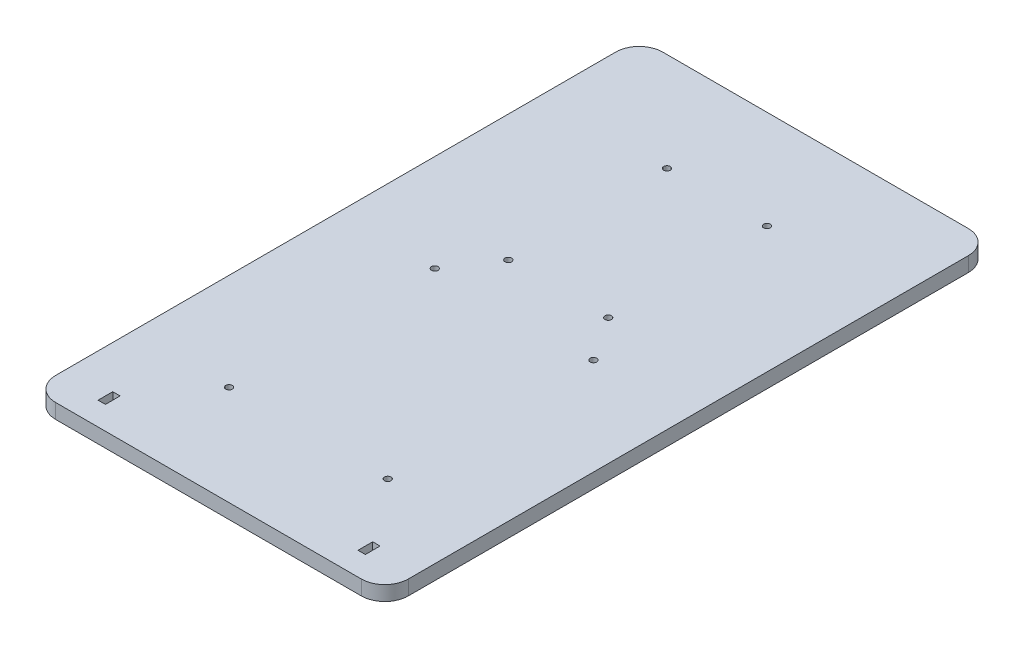
ISO-10303-21;
HEADER;
FILE_DESCRIPTION(('STEP AP214'),'2;1');
FILE_NAME('part.step','',(''),(''),'','','');
FILE_SCHEMA(('AUTOMOTIVE_DESIGN { 1 0 10303 214 1 1 1 1 }'));
ENDSEC;
DATA;
#1=APPLICATION_CONTEXT('core data for automotive mechanical design processes');
#2=APPLICATION_PROTOCOL_DEFINITION('international standard','automotive_design',2000,#1);
#3=PRODUCT_CONTEXT('',#1,'mechanical');
#4=PRODUCT('Part','Part','',(#3));
#5=PRODUCT_RELATED_PRODUCT_CATEGORY('part','',(#4));
#6=PRODUCT_DEFINITION_FORMATION('','',#4);
#7=PRODUCT_DEFINITION_CONTEXT('part definition',#1,'design');
#8=PRODUCT_DEFINITION('design','',#6,#7);
#9=PRODUCT_DEFINITION_SHAPE('','',#8);
#10=(LENGTH_UNIT() NAMED_UNIT(*) SI_UNIT(.MILLI.,.METRE.));
#11=(NAMED_UNIT(*) PLANE_ANGLE_UNIT() SI_UNIT($,.RADIAN.));
#12=(NAMED_UNIT(*) SI_UNIT($,.STERADIAN.) SOLID_ANGLE_UNIT());
#13=UNCERTAINTY_MEASURE_WITH_UNIT(LENGTH_MEASURE(1.E-05),#10,'distance_accuracy_value','');
#14=(GEOMETRIC_REPRESENTATION_CONTEXT(3) GLOBAL_UNCERTAINTY_ASSIGNED_CONTEXT((#13)) GLOBAL_UNIT_ASSIGNED_CONTEXT((#10,
#11,#12)) REPRESENTATION_CONTEXT('',''));
#15=CARTESIAN_POINT('',(0.,0.,0.));
#16=DIRECTION('',(0.,0.,1.));
#17=DIRECTION('',(1.,0.,0.));
#18=AXIS2_PLACEMENT_3D('',#15,#16,#17);
#19=CARTESIAN_POINT('',(0.,6.35,0.));
#20=DIRECTION('',(0.,-1.,0.));
#21=DIRECTION('',(0.,0.,-1.));
#22=AXIS2_PLACEMENT_3D('',#19,#20,#21);
#23=PLANE('',#22);
#24=DIRECTION('',(0.,0.,1.));
#25=VECTOR('',#24,1.);
#26=CARTESIAN_POINT('',(18.4410604,6.35,-16.3877359656356));
#27=LINE('',#26,#25);
#28=CARTESIAN_POINT('',(18.4410604,6.35,-16.3877359656356));
#29=VERTEX_POINT('',#28);
#30=CARTESIAN_POINT('',(18.4410604,6.35,-10.0377359656356));
#31=VERTEX_POINT('',#30);
#32=EDGE_CURVE('E211',#29,#31,#27,.T.);
#33=ORIENTED_EDGE('',*,*,#32,.F.);
#34=DIRECTION('',(-1.,0.,0.));
#35=VECTOR('',#34,1.);
#36=CARTESIAN_POINT('',(18.4410604,6.35,-16.3877359656356));
#37=LINE('',#36,#35);
#38=CARTESIAN_POINT('',(21.6160604,6.35,-16.3877359656356));
#39=VERTEX_POINT('',#38);
#40=EDGE_CURVE('E222',#39,#29,#37,.T.);
#41=ORIENTED_EDGE('',*,*,#40,.F.);
#42=DIRECTION('',(0.,0.,-1.));
#43=VECTOR('',#42,1.);
#44=CARTESIAN_POINT('',(21.6160604,6.35,-16.3877359656356));
#45=LINE('',#44,#43);
#46=CARTESIAN_POINT('',(21.6160604,6.35,-10.0377359656356));
#47=VERTEX_POINT('',#46);
#48=EDGE_CURVE('E218',#47,#39,#45,.T.);
#49=ORIENTED_EDGE('',*,*,#48,.F.);
#50=DIRECTION('',(1.,0.,0.));
#51=VECTOR('',#50,1.);
#52=CARTESIAN_POINT('',(18.4410604,6.35,-10.0377359656356));
#53=LINE('',#52,#51);
#54=EDGE_CURVE('E214',#31,#47,#53,.T.);
#55=ORIENTED_EDGE('',*,*,#54,.F.);
#56=EDGE_LOOP('',(#33,#41,#49,#55));
#57=FACE_BOUND('',#56,.T.);
#58=DIRECTION('',(1.,0.,0.));
#59=VECTOR('',#58,1.);
#60=CARTESIAN_POINT('',(152.4,6.35,0.));
#61=LINE('',#60,#59);
#62=CARTESIAN_POINT('',(10.1600000000001,6.35,0.));
#63=VERTEX_POINT('',#62);
#64=CARTESIAN_POINT('',(142.24,6.35,0.));
#65=VERTEX_POINT('',#64);
#66=EDGE_CURVE('E258',#63,#65,#61,.T.);
#67=ORIENTED_EDGE('',*,*,#66,.T.);
#68=CARTESIAN_POINT('',(142.24,6.35,-10.16));
#69=DIRECTION('',(0.,-1.,0.));
#70=DIRECTION('',(0.,0.,-1.));
#71=AXIS2_PLACEMENT_3D('',#68,#69,#70);
#72=CIRCLE('',#71,10.16);
#73=CARTESIAN_POINT('',(152.4,6.35,-10.16));
#74=VERTEX_POINT('',#73);
#75=EDGE_CURVE('E316',#65,#74,#72,.F.);
#76=ORIENTED_EDGE('',*,*,#75,.T.);
#77=DIRECTION('',(0.,0.,-1.));
#78=VECTOR('',#77,1.);
#79=CARTESIAN_POINT('',(152.4,6.35,-262.339276313461));
#80=LINE('',#79,#78);
#81=CARTESIAN_POINT('',(152.4,6.35,-252.179276313461));
#82=VERTEX_POINT('',#81);
#83=EDGE_CURVE('E263',#74,#82,#80,.T.);
#84=ORIENTED_EDGE('',*,*,#83,.T.);
#85=CARTESIAN_POINT('',(142.24,6.35,-252.179276313461));
#86=DIRECTION('',(0.,-1.,0.));
#87=DIRECTION('',(0.,0.,-1.));
#88=AXIS2_PLACEMENT_3D('',#85,#86,#87);
#89=CIRCLE('',#88,10.16);
#90=CARTESIAN_POINT('',(142.24,6.35,-262.339276313461));
#91=VERTEX_POINT('',#90);
#92=EDGE_CURVE('E62',#82,#91,#89,.F.);
#93=ORIENTED_EDGE('',*,*,#92,.T.);
#94=DIRECTION('',(-1.,0.,0.));
#95=VECTOR('',#94,1.);
#96=CARTESIAN_POINT('',(0.,6.35,-262.339276313461));
#97=LINE('',#96,#95);
#98=CARTESIAN_POINT('',(10.16,6.35,-262.339276313461));
#99=VERTEX_POINT('',#98);
#100=EDGE_CURVE('E266',#91,#99,#97,.T.);
#101=ORIENTED_EDGE('',*,*,#100,.T.);
#102=CARTESIAN_POINT('',(10.16,6.35,-252.179276313461));
#103=DIRECTION('',(0.,-1.,0.));
#104=DIRECTION('',(0.,0.,-1.));
#105=AXIS2_PLACEMENT_3D('',#102,#103,#104);
#106=CIRCLE('',#105,10.16);
#107=CARTESIAN_POINT('',(0.,6.35,-252.179276313461));
#108=VERTEX_POINT('',#107);
#109=EDGE_CURVE('E308',#99,#108,#106,.F.);
#110=ORIENTED_EDGE('',*,*,#109,.T.);
#111=DIRECTION('',(0.,0.,1.));
#112=VECTOR('',#111,1.);
#113=CARTESIAN_POINT('',(0.,6.35,0.));
#114=LINE('',#113,#112);
#115=CARTESIAN_POINT('',(0.,6.35,-10.16));
#116=VERTEX_POINT('',#115);
#117=EDGE_CURVE('E254',#108,#116,#114,.T.);
#118=ORIENTED_EDGE('',*,*,#117,.T.);
#119=CARTESIAN_POINT('',(10.16,6.35,-10.16));
#120=DIRECTION('',(0.,-1.,0.));
#121=DIRECTION('',(0.,0.,-1.));
#122=AXIS2_PLACEMENT_3D('',#119,#120,#121);
#123=CIRCLE('',#122,10.16);
#124=EDGE_CURVE('E311',#116,#63,#123,.F.);
#125=ORIENTED_EDGE('',*,*,#124,.T.);
#126=EDGE_LOOP('',(#67,#76,#84,#93,#101,#110,#118,#125));
#127=FACE_BOUND('',#126,.T.);
#128=DIRECTION('',(0.,0.,-1.));
#129=VECTOR('',#128,1.);
#130=CARTESIAN_POINT('',(133.9589396,6.35,-16.3877359656356));
#131=LINE('',#130,#129);
#132=CARTESIAN_POINT('',(133.9589396,6.35,-10.0377359656356));
#133=VERTEX_POINT('',#132);
#134=CARTESIAN_POINT('',(133.9589396,6.35,-16.3877359656356));
#135=VERTEX_POINT('',#134);
#136=EDGE_CURVE('E155',#133,#135,#131,.T.);
#137=ORIENTED_EDGE('',*,*,#136,.F.);
#138=DIRECTION('',(1.,0.,0.));
#139=VECTOR('',#138,1.);
#140=CARTESIAN_POINT('',(133.9589396,6.35,-10.0377359656356));
#141=LINE('',#140,#139);
#142=CARTESIAN_POINT('',(130.7839396,6.35,-10.0377359656356));
#143=VERTEX_POINT('',#142);
#144=EDGE_CURVE('E185',#143,#133,#141,.T.);
#145=ORIENTED_EDGE('',*,*,#144,.F.);
#146=DIRECTION('',(0.,0.,1.));
#147=VECTOR('',#146,1.);
#148=CARTESIAN_POINT('',(130.7839396,6.35,-16.3877359656356));
#149=LINE('',#148,#147);
#150=CARTESIAN_POINT('',(130.7839396,6.35,-16.3877359656356));
#151=VERTEX_POINT('',#150);
#152=EDGE_CURVE('E181',#151,#143,#149,.T.);
#153=ORIENTED_EDGE('',*,*,#152,.F.);
#154=DIRECTION('',(-1.,0.,0.));
#155=VECTOR('',#154,1.);
#156=CARTESIAN_POINT('',(133.9589396,6.35,-16.3877359656356));
#157=LINE('',#156,#155);
#158=EDGE_CURVE('E166',#135,#151,#157,.T.);
#159=ORIENTED_EDGE('',*,*,#158,.F.);
#160=EDGE_LOOP('',(#137,#145,#153,#159));
#161=FACE_BOUND('',#160,.T.);
#162=CARTESIAN_POINT('',(41.9100000000001,6.35,-43.18));
#163=DIRECTION('',(0.,1.,0.));
#164=DIRECTION('',(0.,0.,1.));
#165=AXIS2_PLACEMENT_3D('',#162,#163,#164);
#166=CIRCLE('',#165,1.4224);
#167=CARTESIAN_POINT('',(41.9100000000001,6.35,-41.7576));
#168=VERTEX_POINT('',#167);
#169=EDGE_CURVE('E194',#168,#168,#166,.T.);
#170=ORIENTED_EDGE('',*,*,#169,.F.);
#171=EDGE_LOOP('',(#170));
#172=FACE_BOUND('',#171,.T.);
#173=CARTESIAN_POINT('',(41.9100000000001,6.35,-132.08));
#174=DIRECTION('',(0.,1.,0.));
#175=DIRECTION('',(0.,0.,1.));
#176=AXIS2_PLACEMENT_3D('',#173,#174,#175);
#177=CIRCLE('',#176,1.4224);
#178=CARTESIAN_POINT('',(41.9100000000001,6.35,-130.6576));
#179=VERTEX_POINT('',#178);
#180=EDGE_CURVE('E667',#179,#179,#177,.T.);
#181=ORIENTED_EDGE('',*,*,#180,.F.);
#182=EDGE_LOOP('',(#181));
#183=FACE_BOUND('',#182,.T.);
#184=CARTESIAN_POINT('',(110.49,6.35,-132.08));
#185=DIRECTION('',(0.,1.,0.));
#186=DIRECTION('',(0.,0.,-1.));
#187=AXIS2_PLACEMENT_3D('',#184,#185,#186);
#188=CIRCLE('',#187,1.4224);
#189=CARTESIAN_POINT('',(110.49,6.35,-133.5024));
#190=VERTEX_POINT('',#189);
#191=EDGE_CURVE('E660',#190,#190,#188,.T.);
#192=ORIENTED_EDGE('',*,*,#191,.F.);
#193=EDGE_LOOP('',(#192));
#194=FACE_BOUND('',#193,.T.);
#195=CARTESIAN_POINT('',(110.49,6.35,-43.18));
#196=DIRECTION('',(0.,1.,0.));
#197=DIRECTION('',(0.,0.,-1.));
#198=AXIS2_PLACEMENT_3D('',#195,#196,#197);
#199=CIRCLE('',#198,1.42239999999999);
#200=CARTESIAN_POINT('',(110.49,6.35,-44.6024));
#201=VERTEX_POINT('',#200);
#202=EDGE_CURVE('E653',#201,#201,#199,.T.);
#203=ORIENTED_EDGE('',*,*,#202,.F.);
#204=EDGE_LOOP('',(#203));
#205=FACE_BOUND('',#204,.T.);
#206=CARTESIAN_POINT('',(54.6100000000001,6.35,-219.73766874797));
#207=DIRECTION('',(0.,1.,0.));
#208=DIRECTION('',(0.,0.,1.));
#209=AXIS2_PLACEMENT_3D('',#206,#207,#208);
#210=CIRCLE('',#209,1.4224);
#211=CARTESIAN_POINT('',(54.6100000000001,6.35,-218.31526874797));
#212=VERTEX_POINT('',#211);
#213=EDGE_CURVE('E646',#212,#212,#210,.T.);
#214=ORIENTED_EDGE('',*,*,#213,.F.);
#215=EDGE_LOOP('',(#214));
#216=FACE_BOUND('',#215,.T.);
#217=CARTESIAN_POINT('',(54.6100000000001,6.35,-151.15766874797));
#218=DIRECTION('',(0.,1.,0.));
#219=DIRECTION('',(0.,0.,1.));
#220=AXIS2_PLACEMENT_3D('',#217,#218,#219);
#221=CIRCLE('',#220,1.4224);
#222=CARTESIAN_POINT('',(54.6100000000001,6.35,-149.73526874797));
#223=VERTEX_POINT('',#222);
#224=EDGE_CURVE('E639',#223,#223,#221,.T.);
#225=ORIENTED_EDGE('',*,*,#224,.F.);
#226=EDGE_LOOP('',(#225));
#227=FACE_BOUND('',#226,.T.);
#228=CARTESIAN_POINT('',(97.7900000000001,6.35,-151.15766874797));
#229=DIRECTION('',(0.,1.,0.));
#230=DIRECTION('',(0.,0.,-1.));
#231=AXIS2_PLACEMENT_3D('',#228,#229,#230);
#232=CIRCLE('',#231,1.4224);
#233=CARTESIAN_POINT('',(97.7900000000001,6.35,-152.58006874797));
#234=VERTEX_POINT('',#233);
#235=EDGE_CURVE('E632',#234,#234,#232,.T.);
#236=ORIENTED_EDGE('',*,*,#235,.F.);
#237=EDGE_LOOP('',(#236));
#238=FACE_BOUND('',#237,.T.);
#239=CARTESIAN_POINT('',(97.7900000000001,6.35,-219.73766874797));
#240=DIRECTION('',(0.,1.,0.));
#241=DIRECTION('',(0.,0.,-1.));
#242=AXIS2_PLACEMENT_3D('',#239,#240,#241);
#243=CIRCLE('',#242,1.4224);
#244=CARTESIAN_POINT('',(97.7900000000001,6.35,-221.16006874797));
#245=VERTEX_POINT('',#244);
#246=EDGE_CURVE('E625',#245,#245,#243,.T.);
#247=ORIENTED_EDGE('',*,*,#246,.F.);
#248=EDGE_LOOP('',(#247));
#249=FACE_BOUND('',#248,.T.);
#250=ADVANCED_FACE('F39',(#57,#127,#161,#172,#183,#194,#205,#216,#227,#238,#249),#23,.F.);
#251=CARTESIAN_POINT('',(0.,0.,0.));
#252=DIRECTION('',(0.,-1.,0.));
#253=DIRECTION('',(0.,0.,-1.));
#254=AXIS2_PLACEMENT_3D('',#251,#252,#253);
#255=PLANE('',#254);
#256=CARTESIAN_POINT('',(97.7900000000001,0.,-151.15766874797));
#257=DIRECTION('',(0.,1.,0.));
#258=DIRECTION('',(0.,0.,-1.));
#259=AXIS2_PLACEMENT_3D('',#256,#257,#258);
#260=CIRCLE('',#259,1.4224);
#261=CARTESIAN_POINT('',(97.7900000000001,0.,-152.58006874797));
#262=VERTEX_POINT('',#261);
#263=EDGE_CURVE('E629',#262,#262,#260,.T.);
#264=ORIENTED_EDGE('',*,*,#263,.T.);
#265=EDGE_LOOP('',(#264));
#266=FACE_BOUND('',#265,.T.);
#267=CARTESIAN_POINT('',(54.6100000000001,0.,-219.73766874797));
#268=DIRECTION('',(0.,1.,0.));
#269=DIRECTION('',(0.,0.,1.));
#270=AXIS2_PLACEMENT_3D('',#267,#268,#269);
#271=CIRCLE('',#270,1.4224);
#272=CARTESIAN_POINT('',(54.6100000000001,0.,-218.31526874797));
#273=VERTEX_POINT('',#272);
#274=EDGE_CURVE('E643',#273,#273,#271,.T.);
#275=ORIENTED_EDGE('',*,*,#274,.T.);
#276=EDGE_LOOP('',(#275));
#277=FACE_BOUND('',#276,.T.);
#278=CARTESIAN_POINT('',(110.49,0.,-132.08));
#279=DIRECTION('',(0.,1.,0.));
#280=DIRECTION('',(0.,0.,-1.));
#281=AXIS2_PLACEMENT_3D('',#278,#279,#280);
#282=CIRCLE('',#281,1.4224);
#283=CARTESIAN_POINT('',(110.49,0.,-133.5024));
#284=VERTEX_POINT('',#283);
#285=EDGE_CURVE('E657',#284,#284,#282,.T.);
#286=ORIENTED_EDGE('',*,*,#285,.T.);
#287=EDGE_LOOP('',(#286));
#288=FACE_BOUND('',#287,.T.);
#289=CARTESIAN_POINT('',(41.9100000000001,0.,-43.18));
#290=DIRECTION('',(0.,1.,0.));
#291=DIRECTION('',(0.,0.,1.));
#292=AXIS2_PLACEMENT_3D('',#289,#290,#291);
#293=CIRCLE('',#292,1.4224);
#294=CARTESIAN_POINT('',(41.9100000000001,0.,-41.7576));
#295=VERTEX_POINT('',#294);
#296=EDGE_CURVE('E671',#295,#295,#293,.T.);
#297=ORIENTED_EDGE('',*,*,#296,.T.);
#298=EDGE_LOOP('',(#297));
#299=FACE_BOUND('',#298,.T.);
#300=DIRECTION('',(0.,0.,-1.));
#301=VECTOR('',#300,1.);
#302=CARTESIAN_POINT('',(152.4,0.,-262.339276313461));
#303=LINE('',#302,#301);
#304=CARTESIAN_POINT('',(152.4,0.,-10.16));
#305=VERTEX_POINT('',#304);
#306=CARTESIAN_POINT('',(152.4,0.,-252.179276313461));
#307=VERTEX_POINT('',#306);
#308=EDGE_CURVE('E277',#305,#307,#303,.T.);
#309=ORIENTED_EDGE('',*,*,#308,.F.);
#310=CARTESIAN_POINT('',(142.24,0.,-10.16));
#311=DIRECTION('',(0.,-1.,0.));
#312=DIRECTION('',(0.,0.,-1.));
#313=AXIS2_PLACEMENT_3D('',#310,#311,#312);
#314=CIRCLE('',#313,10.16);
#315=CARTESIAN_POINT('',(142.24,0.,0.));
#316=VERTEX_POINT('',#315);
#317=EDGE_CURVE('E298',#305,#316,#314,.T.);
#318=ORIENTED_EDGE('',*,*,#317,.T.);
#319=DIRECTION('',(1.,0.,0.));
#320=VECTOR('',#319,1.);
#321=CARTESIAN_POINT('',(152.4,0.,0.));
#322=LINE('',#321,#320);
#323=CARTESIAN_POINT('',(10.1600000000001,0.,0.));
#324=VERTEX_POINT('',#323);
#325=EDGE_CURVE('E273',#324,#316,#322,.T.);
#326=ORIENTED_EDGE('',*,*,#325,.F.);
#327=CARTESIAN_POINT('',(10.16,0.,-10.16));
#328=DIRECTION('',(0.,-1.,0.));
#329=DIRECTION('',(0.,0.,-1.));
#330=AXIS2_PLACEMENT_3D('',#327,#328,#329);
#331=CIRCLE('',#330,10.16);
#332=CARTESIAN_POINT('',(0.,0.,-10.16));
#333=VERTEX_POINT('',#332);
#334=EDGE_CURVE('E292',#324,#333,#331,.T.);
#335=ORIENTED_EDGE('',*,*,#334,.T.);
#336=DIRECTION('',(0.,0.,1.));
#337=VECTOR('',#336,1.);
#338=CARTESIAN_POINT('',(0.,0.,0.));
#339=LINE('',#338,#337);
#340=CARTESIAN_POINT('',(0.,0.,-252.179276313461));
#341=VERTEX_POINT('',#340);
#342=EDGE_CURVE('E253',#341,#333,#339,.T.);
#343=ORIENTED_EDGE('',*,*,#342,.F.);
#344=CARTESIAN_POINT('',(10.16,0.,-252.179276313461));
#345=DIRECTION('',(0.,-1.,0.));
#346=DIRECTION('',(0.,0.,-1.));
#347=AXIS2_PLACEMENT_3D('',#344,#345,#346);
#348=CIRCLE('',#347,10.16);
#349=CARTESIAN_POINT('',(10.16,0.,-262.339276313461));
#350=VERTEX_POINT('',#349);
#351=EDGE_CURVE('E289',#341,#350,#348,.T.);
#352=ORIENTED_EDGE('',*,*,#351,.T.);
#353=DIRECTION('',(-1.,0.,0.));
#354=VECTOR('',#353,1.);
#355=CARTESIAN_POINT('',(0.,0.,-262.339276313461));
#356=LINE('',#355,#354);
#357=CARTESIAN_POINT('',(142.24,0.,-262.339276313461));
#358=VERTEX_POINT('',#357);
#359=EDGE_CURVE('E259',#358,#350,#356,.T.);
#360=ORIENTED_EDGE('',*,*,#359,.F.);
#361=CARTESIAN_POINT('',(142.24,0.,-252.179276313461));
#362=DIRECTION('',(0.,-1.,0.));
#363=DIRECTION('',(0.,0.,-1.));
#364=AXIS2_PLACEMENT_3D('',#361,#362,#363);
#365=CIRCLE('',#364,10.16);
#366=EDGE_CURVE('E295',#358,#307,#365,.T.);
#367=ORIENTED_EDGE('',*,*,#366,.T.);
#368=EDGE_LOOP('',(#309,#318,#326,#335,#343,#352,#360,#367));
#369=FACE_BOUND('',#368,.T.);
#370=DIRECTION('',(-1.,0.,0.));
#371=VECTOR('',#370,1.);
#372=CARTESIAN_POINT('',(18.4410604,0.,-16.3877359656356));
#373=LINE('',#372,#371);
#374=CARTESIAN_POINT('',(21.6160604,0.,-16.3877359656356));
#375=VERTEX_POINT('',#374);
#376=CARTESIAN_POINT('',(18.4410604,0.,-16.3877359656356));
#377=VERTEX_POINT('',#376);
#378=EDGE_CURVE('E215',#375,#377,#373,.T.);
#379=ORIENTED_EDGE('',*,*,#378,.T.);
#380=DIRECTION('',(0.,0.,1.));
#381=VECTOR('',#380,1.);
#382=CARTESIAN_POINT('',(18.4410604,0.,-16.3877359656356));
#383=LINE('',#382,#381);
#384=CARTESIAN_POINT('',(18.4410604,0.,-10.0377359656356));
#385=VERTEX_POINT('',#384);
#386=EDGE_CURVE('E175',#377,#385,#383,.T.);
#387=ORIENTED_EDGE('',*,*,#386,.T.);
#388=DIRECTION('',(1.,0.,0.));
#389=VECTOR('',#388,1.);
#390=CARTESIAN_POINT('',(18.4410604,0.,-10.0377359656356));
#391=LINE('',#390,#389);
#392=CARTESIAN_POINT('',(21.6160604,0.,-10.0377359656356));
#393=VERTEX_POINT('',#392);
#394=EDGE_CURVE('E229',#385,#393,#391,.T.);
#395=ORIENTED_EDGE('',*,*,#394,.T.);
#396=DIRECTION('',(0.,0.,-1.));
#397=VECTOR('',#396,1.);
#398=CARTESIAN_POINT('',(21.6160604,0.,-16.3877359656356));
#399=LINE('',#398,#397);
#400=EDGE_CURVE('E233',#393,#375,#399,.T.);
#401=ORIENTED_EDGE('',*,*,#400,.T.);
#402=EDGE_LOOP('',(#379,#387,#395,#401));
#403=FACE_BOUND('',#402,.T.);
#404=DIRECTION('',(1.,0.,0.));
#405=VECTOR('',#404,1.);
#406=CARTESIAN_POINT('',(133.9589396,0.,-10.0377359656356));
#407=LINE('',#406,#405);
#408=CARTESIAN_POINT('',(130.7839396,0.,-10.0377359656356));
#409=VERTEX_POINT('',#408);
#410=CARTESIAN_POINT('',(133.9589396,0.,-10.0377359656356));
#411=VERTEX_POINT('',#410);
#412=EDGE_CURVE('E167',#409,#411,#407,.T.);
#413=ORIENTED_EDGE('',*,*,#412,.T.);
#414=DIRECTION('',(0.,0.,-1.));
#415=VECTOR('',#414,1.);
#416=CARTESIAN_POINT('',(133.9589396,0.,-16.3877359656356));
#417=LINE('',#416,#415);
#418=CARTESIAN_POINT('',(133.9589396,0.,-16.3877359656356));
#419=VERTEX_POINT('',#418);
#420=EDGE_CURVE('E191',#411,#419,#417,.T.);
#421=ORIENTED_EDGE('',*,*,#420,.T.);
#422=DIRECTION('',(-1.,0.,0.));
#423=VECTOR('',#422,1.);
#424=CARTESIAN_POINT('',(133.9589396,0.,-16.3877359656356));
#425=LINE('',#424,#423);
#426=CARTESIAN_POINT('',(130.7839396,0.,-16.3877359656356));
#427=VERTEX_POINT('',#426);
#428=EDGE_CURVE('E173',#419,#427,#425,.T.);
#429=ORIENTED_EDGE('',*,*,#428,.T.);
#430=DIRECTION('',(0.,0.,1.));
#431=VECTOR('',#430,1.);
#432=CARTESIAN_POINT('',(130.7839396,0.,-16.3877359656356));
#433=LINE('',#432,#431);
#434=EDGE_CURVE('E197',#427,#409,#433,.T.);
#435=ORIENTED_EDGE('',*,*,#434,.T.);
#436=EDGE_LOOP('',(#413,#421,#429,#435));
#437=FACE_BOUND('',#436,.T.);
#438=CARTESIAN_POINT('',(41.9100000000001,0.,-132.08));
#439=DIRECTION('',(0.,1.,0.));
#440=DIRECTION('',(0.,0.,1.));
#441=AXIS2_PLACEMENT_3D('',#438,#439,#440);
#442=CIRCLE('',#441,1.4224);
#443=CARTESIAN_POINT('',(41.9100000000001,0.,-130.6576));
#444=VERTEX_POINT('',#443);
#445=EDGE_CURVE('E611',#444,#444,#442,.T.);
#446=ORIENTED_EDGE('',*,*,#445,.T.);
#447=EDGE_LOOP('',(#446));
#448=FACE_BOUND('',#447,.T.);
#449=CARTESIAN_POINT('',(110.49,0.,-43.18));
#450=DIRECTION('',(0.,1.,0.));
#451=DIRECTION('',(0.,0.,-1.));
#452=AXIS2_PLACEMENT_3D('',#449,#450,#451);
#453=CIRCLE('',#452,1.42239999999999);
#454=CARTESIAN_POINT('',(110.49,0.,-44.6024));
#455=VERTEX_POINT('',#454);
#456=EDGE_CURVE('E615',#455,#455,#453,.T.);
#457=ORIENTED_EDGE('',*,*,#456,.T.);
#458=EDGE_LOOP('',(#457));
#459=FACE_BOUND('',#458,.T.);
#460=CARTESIAN_POINT('',(54.6100000000001,0.,-151.15766874797));
#461=DIRECTION('',(0.,1.,0.));
#462=DIRECTION('',(0.,0.,1.));
#463=AXIS2_PLACEMENT_3D('',#460,#461,#462);
#464=CIRCLE('',#463,1.4224);
#465=CARTESIAN_POINT('',(54.6100000000001,0.,-149.73526874797));
#466=VERTEX_POINT('',#465);
#467=EDGE_CURVE('E619',#466,#466,#464,.T.);
#468=ORIENTED_EDGE('',*,*,#467,.T.);
#469=EDGE_LOOP('',(#468));
#470=FACE_BOUND('',#469,.T.);
#471=CARTESIAN_POINT('',(97.7900000000001,0.,-219.73766874797));
#472=DIRECTION('',(0.,1.,0.));
#473=DIRECTION('',(0.,0.,-1.));
#474=AXIS2_PLACEMENT_3D('',#471,#472,#473);
#475=CIRCLE('',#474,1.4224);
#476=CARTESIAN_POINT('',(97.7900000000001,0.,-221.16006874797));
#477=VERTEX_POINT('',#476);
#478=EDGE_CURVE('E622',#477,#477,#475,.T.);
#479=ORIENTED_EDGE('',*,*,#478,.T.);
#480=EDGE_LOOP('',(#479));
#481=FACE_BOUND('',#480,.T.);
#482=ADVANCED_FACE('F336',(#266,#277,#288,#299,#369,#403,#437,#448,#459,#470,#481),#255,.T.);
#483=CARTESIAN_POINT('',(0.,6.35,0.));
#484=DIRECTION('',(1.,0.,0.));
#485=DIRECTION('',(0.,0.,-1.));
#486=AXIS2_PLACEMENT_3D('',#483,#484,#485);
#487=PLANE('',#486);
#488=ORIENTED_EDGE('',*,*,#342,.T.);
#489=DIRECTION('',(0.,-1.,0.));
#490=VECTOR('',#489,1.);
#491=CARTESIAN_POINT('',(0.,6.35,-10.16));
#492=LINE('',#491,#490);
#493=EDGE_CURVE('E11',#333,#116,#492,.F.);
#494=ORIENTED_EDGE('',*,*,#493,.T.);
#495=ORIENTED_EDGE('',*,*,#117,.F.);
#496=DIRECTION('',(0.,-1.,0.));
#497=VECTOR('',#496,1.);
#498=CARTESIAN_POINT('',(0.,6.35,-252.179276313461));
#499=LINE('',#498,#497);
#500=EDGE_CURVE('E48',#108,#341,#499,.T.);
#501=ORIENTED_EDGE('',*,*,#500,.T.);
#502=EDGE_LOOP('',(#488,#494,#495,#501));
#503=FACE_BOUND('',#502,.T.);
#504=ADVANCED_FACE('F330',(#503),#487,.F.);
#505=CARTESIAN_POINT('',(152.4,6.35,0.));
#506=DIRECTION('',(0.,0.,-1.));
#507=DIRECTION('',(-1.,0.,0.));
#508=AXIS2_PLACEMENT_3D('',#505,#506,#507);
#509=PLANE('',#508);
#510=ORIENTED_EDGE('',*,*,#325,.T.);
#511=DIRECTION('',(0.,-1.,0.));
#512=VECTOR('',#511,1.);
#513=CARTESIAN_POINT('',(142.24,6.35,0.));
#514=LINE('',#513,#512);
#515=EDGE_CURVE('E305',#316,#65,#514,.F.);
#516=ORIENTED_EDGE('',*,*,#515,.T.);
#517=ORIENTED_EDGE('',*,*,#66,.F.);
#518=DIRECTION('',(0.,-1.,0.));
#519=VECTOR('',#518,1.);
#520=CARTESIAN_POINT('',(10.16,6.35,0.));
#521=LINE('',#520,#519);
#522=EDGE_CURVE('E301',#63,#324,#521,.T.);
#523=ORIENTED_EDGE('',*,*,#522,.T.);
#524=EDGE_LOOP('',(#510,#516,#517,#523));
#525=FACE_BOUND('',#524,.T.);
#526=ADVANCED_FACE('F346',(#525),#509,.F.);
#527=CARTESIAN_POINT('',(152.4,6.35,-262.339276313461));
#528=DIRECTION('',(-1.,0.,0.));
#529=DIRECTION('',(0.,0.,1.));
#530=AXIS2_PLACEMENT_3D('',#527,#528,#529);
#531=PLANE('',#530);
#532=ORIENTED_EDGE('',*,*,#83,.F.);
#533=DIRECTION('',(0.,-1.,0.));
#534=VECTOR('',#533,1.);
#535=CARTESIAN_POINT('',(152.4,6.35,-10.16));
#536=LINE('',#535,#534);
#537=EDGE_CURVE('E285',#74,#305,#536,.T.);
#538=ORIENTED_EDGE('',*,*,#537,.T.);
#539=ORIENTED_EDGE('',*,*,#308,.T.);
#540=DIRECTION('',(0.,-1.,0.));
#541=VECTOR('',#540,1.);
#542=CARTESIAN_POINT('',(152.4,6.35,-252.179276313461));
#543=LINE('',#542,#541);
#544=EDGE_CURVE('E269',#307,#82,#543,.F.);
#545=ORIENTED_EDGE('',*,*,#544,.T.);
#546=EDGE_LOOP('',(#532,#538,#539,#545));
#547=FACE_BOUND('',#546,.T.);
#548=ADVANCED_FACE('F354',(#547),#531,.F.);
#549=CARTESIAN_POINT('',(0.,6.35,-262.339276313461));
#550=DIRECTION('',(0.,0.,1.));
#551=DIRECTION('',(1.,0.,0.));
#552=AXIS2_PLACEMENT_3D('',#549,#550,#551);
#553=PLANE('',#552);
#554=ORIENTED_EDGE('',*,*,#100,.F.);
#555=DIRECTION('',(0.,-1.,0.));
#556=VECTOR('',#555,1.);
#557=CARTESIAN_POINT('',(142.24,6.35,-262.339276313461));
#558=LINE('',#557,#556);
#559=EDGE_CURVE('E321',#91,#358,#558,.T.);
#560=ORIENTED_EDGE('',*,*,#559,.T.);
#561=ORIENTED_EDGE('',*,*,#359,.T.);
#562=DIRECTION('',(0.,-1.,0.));
#563=VECTOR('',#562,1.);
#564=CARTESIAN_POINT('',(10.16,6.35,-262.339276313461));
#565=LINE('',#564,#563);
#566=EDGE_CURVE('E55',#350,#99,#565,.F.);
#567=ORIENTED_EDGE('',*,*,#566,.T.);
#568=EDGE_LOOP('',(#554,#560,#561,#567));
#569=FACE_BOUND('',#568,.T.);
#570=ADVANCED_FACE('F359',(#569),#553,.F.);
#571=CARTESIAN_POINT('',(18.4410604,6.35,-16.3877359656356));
#572=DIRECTION('',(1.,0.,0.));
#573=DIRECTION('',(0.,0.,-1.));
#574=AXIS2_PLACEMENT_3D('',#571,#572,#573);
#575=PLANE('',#574);
#576=ORIENTED_EDGE('',*,*,#386,.F.);
#577=DIRECTION('',(0.,-1.,0.));
#578=VECTOR('',#577,1.);
#579=CARTESIAN_POINT('',(18.4410604,6.35,-16.3877359656356));
#580=LINE('',#579,#578);
#581=EDGE_CURVE('E225',#29,#377,#580,.T.);
#582=ORIENTED_EDGE('',*,*,#581,.F.);
#583=ORIENTED_EDGE('',*,*,#32,.T.);
#584=DIRECTION('',(0.,-1.,0.));
#585=VECTOR('',#584,1.);
#586=CARTESIAN_POINT('',(18.4410604,6.35,-10.0377359656356));
#587=LINE('',#586,#585);
#588=EDGE_CURVE('E249',#31,#385,#587,.T.);
#589=ORIENTED_EDGE('',*,*,#588,.T.);
#590=EDGE_LOOP('',(#576,#582,#583,#589));
#591=FACE_BOUND('',#590,.T.);
#592=ADVANCED_FACE('F374',(#591),#575,.T.);
#593=CARTESIAN_POINT('',(18.4410604,6.35,-10.0377359656356));
#594=DIRECTION('',(0.,0.,-1.));
#595=DIRECTION('',(-1.,0.,0.));
#596=AXIS2_PLACEMENT_3D('',#593,#594,#595);
#597=PLANE('',#596);
#598=ORIENTED_EDGE('',*,*,#394,.F.);
#599=ORIENTED_EDGE('',*,*,#588,.F.);
#600=ORIENTED_EDGE('',*,*,#54,.T.);
#601=DIRECTION('',(0.,-1.,0.));
#602=VECTOR('',#601,1.);
#603=CARTESIAN_POINT('',(21.6160604,6.35,-10.0377359656356));
#604=LINE('',#603,#602);
#605=EDGE_CURVE('E246',#47,#393,#604,.T.);
#606=ORIENTED_EDGE('',*,*,#605,.T.);
#607=EDGE_LOOP('',(#598,#599,#600,#606));
#608=FACE_BOUND('',#607,.T.);
#609=ADVANCED_FACE('F531',(#608),#597,.T.);
#610=CARTESIAN_POINT('',(21.6160604,6.35,-16.3877359656356));
#611=DIRECTION('',(-1.,0.,0.));
#612=DIRECTION('',(0.,0.,1.));
#613=AXIS2_PLACEMENT_3D('',#610,#611,#612);
#614=PLANE('',#613);
#615=ORIENTED_EDGE('',*,*,#400,.F.);
#616=ORIENTED_EDGE('',*,*,#605,.F.);
#617=ORIENTED_EDGE('',*,*,#48,.T.);
#618=DIRECTION('',(0.,-1.,0.));
#619=VECTOR('',#618,1.);
#620=CARTESIAN_POINT('',(21.6160604,6.35,-16.3877359656356));
#621=LINE('',#620,#619);
#622=EDGE_CURVE('E243',#39,#375,#621,.T.);
#623=ORIENTED_EDGE('',*,*,#622,.T.);
#624=EDGE_LOOP('',(#615,#616,#617,#623));
#625=FACE_BOUND('',#624,.T.);
#626=ADVANCED_FACE('F522',(#625),#614,.T.);
#627=CARTESIAN_POINT('',(18.4410604,6.35,-16.3877359656356));
#628=DIRECTION('',(0.,0.,1.));
#629=DIRECTION('',(1.,0.,0.));
#630=AXIS2_PLACEMENT_3D('',#627,#628,#629);
#631=PLANE('',#630);
#632=ORIENTED_EDGE('',*,*,#378,.F.);
#633=ORIENTED_EDGE('',*,*,#622,.F.);
#634=ORIENTED_EDGE('',*,*,#40,.T.);
#635=ORIENTED_EDGE('',*,*,#581,.T.);
#636=EDGE_LOOP('',(#632,#633,#634,#635));
#637=FACE_BOUND('',#636,.T.);
#638=ADVANCED_FACE('F514',(#637),#631,.T.);
#639=CARTESIAN_POINT('',(133.9589396,6.35,-16.3877359656356));
#640=DIRECTION('',(-1.,0.,0.));
#641=DIRECTION('',(0.,0.,1.));
#642=AXIS2_PLACEMENT_3D('',#639,#640,#641);
#643=PLANE('',#642);
#644=ORIENTED_EDGE('',*,*,#420,.F.);
#645=DIRECTION('',(0.,-1.,0.));
#646=VECTOR('',#645,1.);
#647=CARTESIAN_POINT('',(133.9589396,6.35,-10.0377359656356));
#648=LINE('',#647,#646);
#649=EDGE_CURVE('E161',#133,#411,#648,.T.);
#650=ORIENTED_EDGE('',*,*,#649,.F.);
#651=ORIENTED_EDGE('',*,*,#136,.T.);
#652=DIRECTION('',(0.,-1.,0.));
#653=VECTOR('',#652,1.);
#654=CARTESIAN_POINT('',(133.9589396,6.35,-16.3877359656356));
#655=LINE('',#654,#653);
#656=EDGE_CURVE('E158',#135,#419,#655,.T.);
#657=ORIENTED_EDGE('',*,*,#656,.T.);
#658=EDGE_LOOP('',(#644,#650,#651,#657));
#659=FACE_BOUND('',#658,.T.);
#660=ADVANCED_FACE('F157',(#659),#643,.T.);
#661=CARTESIAN_POINT('',(133.9589396,6.35,-16.3877359656356));
#662=DIRECTION('',(0.,0.,1.));
#663=DIRECTION('',(1.,0.,0.));
#664=AXIS2_PLACEMENT_3D('',#661,#662,#663);
#665=PLANE('',#664);
#666=ORIENTED_EDGE('',*,*,#428,.F.);
#667=ORIENTED_EDGE('',*,*,#656,.F.);
#668=ORIENTED_EDGE('',*,*,#158,.T.);
#669=DIRECTION('',(0.,-1.,0.));
#670=VECTOR('',#669,1.);
#671=CARTESIAN_POINT('',(130.7839396,6.35,-16.3877359656356));
#672=LINE('',#671,#670);
#673=EDGE_CURVE('E176',#151,#427,#672,.T.);
#674=ORIENTED_EDGE('',*,*,#673,.T.);
#675=EDGE_LOOP('',(#666,#667,#668,#674));
#676=FACE_BOUND('',#675,.T.);
#677=ADVANCED_FACE('F170',(#676),#665,.T.);
#678=CARTESIAN_POINT('',(130.7839396,6.35,-16.3877359656356));
#679=DIRECTION('',(1.,0.,0.));
#680=DIRECTION('',(0.,0.,-1.));
#681=AXIS2_PLACEMENT_3D('',#678,#679,#680);
#682=PLANE('',#681);
#683=ORIENTED_EDGE('',*,*,#434,.F.);
#684=ORIENTED_EDGE('',*,*,#673,.F.);
#685=ORIENTED_EDGE('',*,*,#152,.T.);
#686=DIRECTION('',(0.,-1.,0.));
#687=VECTOR('',#686,1.);
#688=CARTESIAN_POINT('',(130.7839396,6.35,-10.0377359656356));
#689=LINE('',#688,#687);
#690=EDGE_CURVE('E206',#143,#409,#689,.T.);
#691=ORIENTED_EDGE('',*,*,#690,.T.);
#692=EDGE_LOOP('',(#683,#684,#685,#691));
#693=FACE_BOUND('',#692,.T.);
#694=ADVANCED_FACE('F490',(#693),#682,.T.);
#695=CARTESIAN_POINT('',(133.9589396,6.35,-10.0377359656356));
#696=DIRECTION('',(0.,0.,-1.));
#697=DIRECTION('',(-1.,0.,0.));
#698=AXIS2_PLACEMENT_3D('',#695,#696,#697);
#699=PLANE('',#698);
#700=ORIENTED_EDGE('',*,*,#412,.F.);
#701=ORIENTED_EDGE('',*,*,#690,.F.);
#702=ORIENTED_EDGE('',*,*,#144,.T.);
#703=ORIENTED_EDGE('',*,*,#649,.T.);
#704=EDGE_LOOP('',(#700,#701,#702,#703));
#705=FACE_BOUND('',#704,.T.);
#706=ADVANCED_FACE('F481',(#705),#699,.T.);
#707=CARTESIAN_POINT('',(41.9100000000001,6.35,-43.18));
#708=DIRECTION('',(0.,-1.,0.));
#709=DIRECTION('',(0.,0.,-1.));
#710=AXIS2_PLACEMENT_3D('',#707,#708,#709);
#711=CYLINDRICAL_SURFACE('',#710,1.4224);
#712=ORIENTED_EDGE('',*,*,#169,.T.);
#713=EDGE_LOOP('',(#712));
#714=FACE_BOUND('',#713,.T.);
#715=ORIENTED_EDGE('',*,*,#296,.F.);
#716=EDGE_LOOP('',(#715));
#717=FACE_BOUND('',#716,.T.);
#718=ADVANCED_FACE('F472',(#714,#717),#711,.F.);
#719=CARTESIAN_POINT('',(41.9100000000001,6.35,-132.08));
#720=DIRECTION('',(0.,-1.,0.));
#721=DIRECTION('',(0.,0.,-1.));
#722=AXIS2_PLACEMENT_3D('',#719,#720,#721);
#723=CYLINDRICAL_SURFACE('',#722,1.4224);
#724=ORIENTED_EDGE('',*,*,#180,.T.);
#725=EDGE_LOOP('',(#724));
#726=FACE_BOUND('',#725,.T.);
#727=ORIENTED_EDGE('',*,*,#445,.F.);
#728=EDGE_LOOP('',(#727));
#729=FACE_BOUND('',#728,.T.);
#730=ADVANCED_FACE('F463',(#726,#729),#723,.F.);
#731=CARTESIAN_POINT('',(110.49,6.35,-132.08));
#732=DIRECTION('',(0.,-1.,0.));
#733=DIRECTION('',(0.,0.,-1.));
#734=AXIS2_PLACEMENT_3D('',#731,#732,#733);
#735=CYLINDRICAL_SURFACE('',#734,1.4224);
#736=ORIENTED_EDGE('',*,*,#191,.T.);
#737=EDGE_LOOP('',(#736));
#738=FACE_BOUND('',#737,.T.);
#739=ORIENTED_EDGE('',*,*,#285,.F.);
#740=EDGE_LOOP('',(#739));
#741=FACE_BOUND('',#740,.T.);
#742=ADVANCED_FACE('F454',(#738,#741),#735,.F.);
#743=CARTESIAN_POINT('',(110.49,6.35,-43.18));
#744=DIRECTION('',(0.,-1.,0.));
#745=DIRECTION('',(0.,0.,-1.));
#746=AXIS2_PLACEMENT_3D('',#743,#744,#745);
#747=CYLINDRICAL_SURFACE('',#746,1.42239999999999);
#748=ORIENTED_EDGE('',*,*,#202,.T.);
#749=EDGE_LOOP('',(#748));
#750=FACE_BOUND('',#749,.T.);
#751=ORIENTED_EDGE('',*,*,#456,.F.);
#752=EDGE_LOOP('',(#751));
#753=FACE_BOUND('',#752,.T.);
#754=ADVANCED_FACE('F445',(#750,#753),#747,.F.);
#755=CARTESIAN_POINT('',(54.6100000000001,6.35,-219.73766874797));
#756=DIRECTION('',(0.,-1.,0.));
#757=DIRECTION('',(0.,0.,-1.));
#758=AXIS2_PLACEMENT_3D('',#755,#756,#757);
#759=CYLINDRICAL_SURFACE('',#758,1.4224);
#760=ORIENTED_EDGE('',*,*,#213,.T.);
#761=EDGE_LOOP('',(#760));
#762=FACE_BOUND('',#761,.T.);
#763=ORIENTED_EDGE('',*,*,#274,.F.);
#764=EDGE_LOOP('',(#763));
#765=FACE_BOUND('',#764,.T.);
#766=ADVANCED_FACE('F436',(#762,#765),#759,.F.);
#767=CARTESIAN_POINT('',(54.6100000000001,6.35,-151.15766874797));
#768=DIRECTION('',(0.,-1.,0.));
#769=DIRECTION('',(0.,0.,-1.));
#770=AXIS2_PLACEMENT_3D('',#767,#768,#769);
#771=CYLINDRICAL_SURFACE('',#770,1.4224);
#772=ORIENTED_EDGE('',*,*,#224,.T.);
#773=EDGE_LOOP('',(#772));
#774=FACE_BOUND('',#773,.T.);
#775=ORIENTED_EDGE('',*,*,#467,.F.);
#776=EDGE_LOOP('',(#775));
#777=FACE_BOUND('',#776,.T.);
#778=ADVANCED_FACE('F427',(#774,#777),#771,.F.);
#779=CARTESIAN_POINT('',(97.7900000000001,6.35,-151.15766874797));
#780=DIRECTION('',(0.,-1.,0.));
#781=DIRECTION('',(0.,0.,-1.));
#782=AXIS2_PLACEMENT_3D('',#779,#780,#781);
#783=CYLINDRICAL_SURFACE('',#782,1.4224);
#784=ORIENTED_EDGE('',*,*,#235,.T.);
#785=EDGE_LOOP('',(#784));
#786=FACE_BOUND('',#785,.T.);
#787=ORIENTED_EDGE('',*,*,#263,.F.);
#788=EDGE_LOOP('',(#787));
#789=FACE_BOUND('',#788,.T.);
#790=ADVANCED_FACE('F418',(#786,#789),#783,.F.);
#791=CARTESIAN_POINT('',(97.7900000000001,6.35,-219.73766874797));
#792=DIRECTION('',(0.,-1.,0.));
#793=DIRECTION('',(0.,0.,-1.));
#794=AXIS2_PLACEMENT_3D('',#791,#792,#793);
#795=CYLINDRICAL_SURFACE('',#794,1.4224);
#796=ORIENTED_EDGE('',*,*,#246,.T.);
#797=EDGE_LOOP('',(#796));
#798=FACE_BOUND('',#797,.T.);
#799=ORIENTED_EDGE('',*,*,#478,.F.);
#800=EDGE_LOOP('',(#799));
#801=FACE_BOUND('',#800,.T.);
#802=ADVANCED_FACE('F387',(#798,#801),#795,.F.);
#803=CARTESIAN_POINT('',(142.24,6.35,-10.16));
#804=DIRECTION('',(0.,-1.,0.));
#805=DIRECTION('',(0.,0.,-1.));
#806=AXIS2_PLACEMENT_3D('',#803,#804,#805);
#807=CYLINDRICAL_SURFACE('',#806,10.16);
#808=ORIENTED_EDGE('',*,*,#75,.F.);
#809=ORIENTED_EDGE('',*,*,#515,.F.);
#810=ORIENTED_EDGE('',*,*,#317,.F.);
#811=ORIENTED_EDGE('',*,*,#537,.F.);
#812=EDGE_LOOP('',(#808,#809,#810,#811));
#813=FACE_BOUND('',#812,.T.);
#814=ADVANCED_FACE('F352',(#813),#807,.T.);
#815=CARTESIAN_POINT('',(142.24,6.35,-252.179276313461));
#816=DIRECTION('',(0.,-1.,0.));
#817=DIRECTION('',(0.,0.,-1.));
#818=AXIS2_PLACEMENT_3D('',#815,#816,#817);
#819=CYLINDRICAL_SURFACE('',#818,10.16);
#820=ORIENTED_EDGE('',*,*,#92,.F.);
#821=ORIENTED_EDGE('',*,*,#544,.F.);
#822=ORIENTED_EDGE('',*,*,#366,.F.);
#823=ORIENTED_EDGE('',*,*,#559,.F.);
#824=EDGE_LOOP('',(#820,#821,#822,#823));
#825=FACE_BOUND('',#824,.T.);
#826=ADVANCED_FACE('F358',(#825),#819,.T.);
#827=CARTESIAN_POINT('',(10.16,6.35,-10.16));
#828=DIRECTION('',(0.,-1.,0.));
#829=DIRECTION('',(0.,0.,-1.));
#830=AXIS2_PLACEMENT_3D('',#827,#828,#829);
#831=CYLINDRICAL_SURFACE('',#830,10.16);
#832=ORIENTED_EDGE('',*,*,#124,.F.);
#833=ORIENTED_EDGE('',*,*,#493,.F.);
#834=ORIENTED_EDGE('',*,*,#334,.F.);
#835=ORIENTED_EDGE('',*,*,#522,.F.);
#836=EDGE_LOOP('',(#832,#833,#834,#835));
#837=FACE_BOUND('',#836,.T.);
#838=ADVANCED_FACE('F343',(#837),#831,.T.);
#839=CARTESIAN_POINT('',(10.16,6.35,-252.179276313461));
#840=DIRECTION('',(0.,-1.,0.));
#841=DIRECTION('',(0.,0.,-1.));
#842=AXIS2_PLACEMENT_3D('',#839,#840,#841);
#843=CYLINDRICAL_SURFACE('',#842,10.16);
#844=ORIENTED_EDGE('',*,*,#109,.F.);
#845=ORIENTED_EDGE('',*,*,#566,.F.);
#846=ORIENTED_EDGE('',*,*,#351,.F.);
#847=ORIENTED_EDGE('',*,*,#500,.F.);
#848=EDGE_LOOP('',(#844,#845,#846,#847));
#849=FACE_BOUND('',#848,.T.);
#850=ADVANCED_FACE('F41',(#849),#843,.T.);
#851=CLOSED_SHELL('',(#250,#482,#504,#526,#548,#570,#592,#609,#626,#638,#660,#677,#694,#706,
#718,#730,#742,#754,#766,#778,#790,#802,#814,#826,#838,#850));
#852=MANIFOLD_SOLID_BREP('B2',#851);
#853=ADVANCED_BREP_SHAPE_REPRESENTATION('',(#18,#852),#14);
#854=SHAPE_DEFINITION_REPRESENTATION(#9,#853);
ENDSEC;
END-ISO-10303-21;
